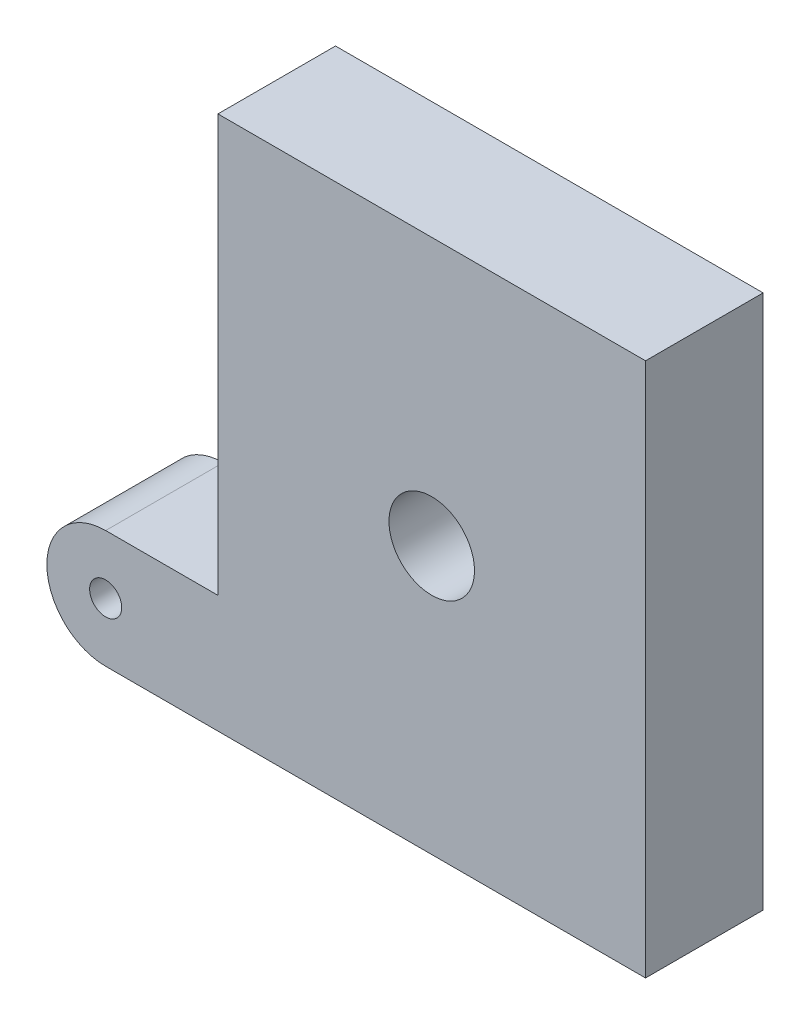
ISO-10303-21;
HEADER;
FILE_DESCRIPTION(('STEP AP214'),'2;1');
FILE_NAME('part.step','',(''),(''),'','','');
FILE_SCHEMA(('AUTOMOTIVE_DESIGN { 1 0 10303 214 1 1 1 1 }'));
ENDSEC;
DATA;
#1=APPLICATION_CONTEXT('core data for automotive mechanical design processes');
#2=APPLICATION_PROTOCOL_DEFINITION('international standard','automotive_design',2000,#1);
#3=PRODUCT_CONTEXT('',#1,'mechanical');
#4=PRODUCT('Part','Part','',(#3));
#5=PRODUCT_RELATED_PRODUCT_CATEGORY('part','',(#4));
#6=PRODUCT_DEFINITION_FORMATION('','',#4);
#7=PRODUCT_DEFINITION_CONTEXT('part definition',#1,'design');
#8=PRODUCT_DEFINITION('design','',#6,#7);
#9=PRODUCT_DEFINITION_SHAPE('','',#8);
#10=(LENGTH_UNIT() NAMED_UNIT(*) SI_UNIT(.MILLI.,.METRE.));
#11=(NAMED_UNIT(*) PLANE_ANGLE_UNIT() SI_UNIT($,.RADIAN.));
#12=(NAMED_UNIT(*) SI_UNIT($,.STERADIAN.) SOLID_ANGLE_UNIT());
#13=UNCERTAINTY_MEASURE_WITH_UNIT(LENGTH_MEASURE(1.E-05),#10,'distance_accuracy_value','');
#14=(GEOMETRIC_REPRESENTATION_CONTEXT(3) GLOBAL_UNCERTAINTY_ASSIGNED_CONTEXT((#13)) GLOBAL_UNIT_ASSIGNED_CONTEXT((#10,
#11,#12)) REPRESENTATION_CONTEXT('',''));
#15=CARTESIAN_POINT('',(0.,0.,0.));
#16=DIRECTION('',(0.,0.,1.));
#17=DIRECTION('',(1.,0.,0.));
#18=AXIS2_PLACEMENT_3D('',#15,#16,#17);
#19=CARTESIAN_POINT('',(50.5,50.,22.));
#20=DIRECTION('',(0.,-1.,0.));
#21=DIRECTION('',(1.,0.,0.));
#22=AXIS2_PLACEMENT_3D('',#19,#20,#21);
#23=PLANE('',#22);
#24=DIRECTION('',(-1.,0.,0.));
#25=VECTOR('',#24,1.);
#26=CARTESIAN_POINT('',(50.5,50.,0.));
#27=LINE('',#26,#25);
#28=CARTESIAN_POINT('',(50.5,50.,0.));
#29=VERTEX_POINT('',#28);
#30=CARTESIAN_POINT('',(-29.5,50.,0.));
#31=VERTEX_POINT('',#30);
#32=EDGE_CURVE('E116',#29,#31,#27,.T.);
#33=ORIENTED_EDGE('',*,*,#32,.T.);
#34=DIRECTION('',(0.,0.,-1.));
#35=VECTOR('',#34,1.);
#36=CARTESIAN_POINT('',(-29.5,50.,22.));
#37=LINE('',#36,#35);
#38=CARTESIAN_POINT('',(-29.5,50.,22.));
#39=VERTEX_POINT('',#38);
#40=EDGE_CURVE('E11',#39,#31,#37,.T.);
#41=ORIENTED_EDGE('',*,*,#40,.F.);
#42=DIRECTION('',(-1.,0.,0.));
#43=VECTOR('',#42,1.);
#44=CARTESIAN_POINT('',(50.5,50.,22.));
#45=LINE('',#44,#43);
#46=CARTESIAN_POINT('',(50.5,50.,22.));
#47=VERTEX_POINT('',#46);
#48=EDGE_CURVE('E128',#47,#39,#45,.T.);
#49=ORIENTED_EDGE('',*,*,#48,.F.);
#50=DIRECTION('',(0.,0.,-1.));
#51=VECTOR('',#50,1.);
#52=CARTESIAN_POINT('',(50.5,50.,22.));
#53=LINE('',#52,#51);
#54=EDGE_CURVE('E115',#47,#29,#53,.T.);
#55=ORIENTED_EDGE('',*,*,#54,.T.);
#56=EDGE_LOOP('',(#33,#41,#49,#55));
#57=FACE_BOUND('',#56,.T.);
#58=ADVANCED_FACE('F32',(#57),#23,.F.);
#59=CARTESIAN_POINT('',(-29.5,50.,22.));
#60=DIRECTION('',(1.,0.,0.));
#61=DIRECTION('',(0.,0.,-1.));
#62=AXIS2_PLACEMENT_3D('',#59,#60,#61);
#63=PLANE('',#62);
#64=DIRECTION('',(0.,-1.,0.));
#65=VECTOR('',#64,1.);
#66=CARTESIAN_POINT('',(-29.5,50.,0.));
#67=LINE('',#66,#65);
#68=CARTESIAN_POINT('',(-29.5,-28.,0.));
#69=VERTEX_POINT('',#68);
#70=EDGE_CURVE('E119',#31,#69,#67,.T.);
#71=ORIENTED_EDGE('',*,*,#70,.T.);
#72=DIRECTION('',(0.,0.,-1.));
#73=VECTOR('',#72,1.);
#74=CARTESIAN_POINT('',(-29.5,-28.,22.));
#75=LINE('',#74,#73);
#76=CARTESIAN_POINT('',(-29.5,-28.,22.));
#77=VERTEX_POINT('',#76);
#78=EDGE_CURVE('E40',#77,#69,#75,.T.);
#79=ORIENTED_EDGE('',*,*,#78,.F.);
#80=DIRECTION('',(0.,-1.,0.));
#81=VECTOR('',#80,1.);
#82=CARTESIAN_POINT('',(-29.5,50.,22.));
#83=LINE('',#82,#81);
#84=EDGE_CURVE('E84',#39,#77,#83,.T.);
#85=ORIENTED_EDGE('',*,*,#84,.F.);
#86=ORIENTED_EDGE('',*,*,#40,.T.);
#87=EDGE_LOOP('',(#71,#79,#85,#86));
#88=FACE_BOUND('',#87,.T.);
#89=ADVANCED_FACE('F153',(#88),#63,.F.);
#90=CARTESIAN_POINT('',(-29.5,-28.,22.));
#91=DIRECTION('',(0.,-1.,0.));
#92=DIRECTION('',(0.,0.,-1.));
#93=AXIS2_PLACEMENT_3D('',#90,#91,#92);
#94=PLANE('',#93);
#95=DIRECTION('',(-1.,0.,0.));
#96=VECTOR('',#95,1.);
#97=CARTESIAN_POINT('',(-29.5,-28.,0.));
#98=LINE('',#97,#96);
#99=CARTESIAN_POINT('',(-50.5,-28.,0.));
#100=VERTEX_POINT('',#99);
#101=EDGE_CURVE('E122',#69,#100,#98,.T.);
#102=ORIENTED_EDGE('',*,*,#101,.T.);
#103=DIRECTION('',(0.,0.,-1.));
#104=VECTOR('',#103,1.);
#105=CARTESIAN_POINT('',(-50.5,-28.,22.));
#106=LINE('',#105,#104);
#107=CARTESIAN_POINT('',(-50.5,-28.,22.));
#108=VERTEX_POINT('',#107);
#109=EDGE_CURVE('E100',#108,#100,#106,.T.);
#110=ORIENTED_EDGE('',*,*,#109,.F.);
#111=DIRECTION('',(-1.,0.,0.));
#112=VECTOR('',#111,1.);
#113=CARTESIAN_POINT('',(-29.5,-28.,22.));
#114=LINE('',#113,#112);
#115=EDGE_CURVE('E108',#77,#108,#114,.T.);
#116=ORIENTED_EDGE('',*,*,#115,.F.);
#117=ORIENTED_EDGE('',*,*,#78,.T.);
#118=EDGE_LOOP('',(#102,#110,#116,#117));
#119=FACE_BOUND('',#118,.T.);
#120=ADVANCED_FACE('F134',(#119),#94,.F.);
#121=CARTESIAN_POINT('',(-50.5,-39.,22.));
#122=DIRECTION('',(0.,0.,-1.));
#123=DIRECTION('',(-1.,0.,0.));
#124=AXIS2_PLACEMENT_3D('',#121,#122,#123);
#125=CYLINDRICAL_SURFACE('',#124,11.);
#126=CARTESIAN_POINT('',(-50.5,-39.,0.));
#127=DIRECTION('',(0.,0.,-1.));
#128=DIRECTION('',(-1.,0.,0.));
#129=AXIS2_PLACEMENT_3D('',#126,#127,#128);
#130=CIRCLE('',#129,11.);
#131=CARTESIAN_POINT('',(-50.5,-50.,0.));
#132=VERTEX_POINT('',#131);
#133=EDGE_CURVE('E99',#132,#100,#130,.T.);
#134=ORIENTED_EDGE('',*,*,#133,.F.);
#135=DIRECTION('',(0.,0.,-1.));
#136=VECTOR('',#135,1.);
#137=CARTESIAN_POINT('',(-50.5,-50.,22.));
#138=LINE('',#137,#136);
#139=CARTESIAN_POINT('',(-50.5,-50.,22.));
#140=VERTEX_POINT('',#139);
#141=EDGE_CURVE('E93',#140,#132,#138,.T.);
#142=ORIENTED_EDGE('',*,*,#141,.F.);
#143=CARTESIAN_POINT('',(-50.5,-39.,22.));
#144=DIRECTION('',(0.,0.,-1.));
#145=DIRECTION('',(-1.,0.,0.));
#146=AXIS2_PLACEMENT_3D('',#143,#144,#145);
#147=CIRCLE('',#146,11.);
#148=EDGE_CURVE('E97',#140,#108,#147,.T.);
#149=ORIENTED_EDGE('',*,*,#148,.T.);
#150=ORIENTED_EDGE('',*,*,#109,.T.);
#151=EDGE_LOOP('',(#134,#142,#149,#150));
#152=FACE_BOUND('',#151,.T.);
#153=ADVANCED_FACE('F95',(#152),#125,.T.);
#154=CARTESIAN_POINT('',(-50.5,-50.,22.));
#155=DIRECTION('',(0.,1.,0.));
#156=DIRECTION('',(0.,0.,1.));
#157=AXIS2_PLACEMENT_3D('',#154,#155,#156);
#158=PLANE('',#157);
#159=DIRECTION('',(1.,0.,0.));
#160=VECTOR('',#159,1.);
#161=CARTESIAN_POINT('',(-50.5,-50.,0.));
#162=LINE('',#161,#160);
#163=CARTESIAN_POINT('',(50.5,-50.,0.));
#164=VERTEX_POINT('',#163);
#165=EDGE_CURVE('E70',#132,#164,#162,.T.);
#166=ORIENTED_EDGE('',*,*,#165,.T.);
#167=DIRECTION('',(0.,0.,-1.));
#168=VECTOR('',#167,1.);
#169=CARTESIAN_POINT('',(50.5,-50.,22.));
#170=LINE('',#169,#168);
#171=CARTESIAN_POINT('',(50.5,-50.,22.));
#172=VERTEX_POINT('',#171);
#173=EDGE_CURVE('E101',#172,#164,#170,.T.);
#174=ORIENTED_EDGE('',*,*,#173,.F.);
#175=DIRECTION('',(1.,0.,0.));
#176=VECTOR('',#175,1.);
#177=CARTESIAN_POINT('',(-50.5,-50.,22.));
#178=LINE('',#177,#176);
#179=EDGE_CURVE('E103',#140,#172,#178,.T.);
#180=ORIENTED_EDGE('',*,*,#179,.F.);
#181=ORIENTED_EDGE('',*,*,#141,.T.);
#182=EDGE_LOOP('',(#166,#174,#180,#181));
#183=FACE_BOUND('',#182,.T.);
#184=ADVANCED_FACE('F104',(#183),#158,.F.);
#185=CARTESIAN_POINT('',(50.5,-50.,22.));
#186=DIRECTION('',(-1.,0.,0.));
#187=DIRECTION('',(0.,0.,1.));
#188=AXIS2_PLACEMENT_3D('',#185,#186,#187);
#189=PLANE('',#188);
#190=DIRECTION('',(0.,1.,0.));
#191=VECTOR('',#190,1.);
#192=CARTESIAN_POINT('',(50.5,-50.,0.));
#193=LINE('',#192,#191);
#194=EDGE_CURVE('E76',#164,#29,#193,.T.);
#195=ORIENTED_EDGE('',*,*,#194,.T.);
#196=ORIENTED_EDGE('',*,*,#54,.F.);
#197=DIRECTION('',(0.,1.,0.));
#198=VECTOR('',#197,1.);
#199=CARTESIAN_POINT('',(50.5,-50.,22.));
#200=LINE('',#199,#198);
#201=EDGE_CURVE('E48',#172,#47,#200,.T.);
#202=ORIENTED_EDGE('',*,*,#201,.F.);
#203=ORIENTED_EDGE('',*,*,#173,.T.);
#204=EDGE_LOOP('',(#195,#196,#202,#203));
#205=FACE_BOUND('',#204,.T.);
#206=ADVANCED_FACE('F141',(#205),#189,.F.);
#207=CARTESIAN_POINT('',(-50.5,-39.,22.));
#208=DIRECTION('',(0.,0.,-1.));
#209=DIRECTION('',(-1.,0.,0.));
#210=AXIS2_PLACEMENT_3D('',#207,#208,#209);
#211=PLANE('',#210);
#212=CARTESIAN_POINT('',(-50.5,-39.,22.));
#213=DIRECTION('',(0.,0.,1.));
#214=DIRECTION('',(1.,0.,0.));
#215=AXIS2_PLACEMENT_3D('',#212,#213,#214);
#216=CIRCLE('',#215,3.);
#217=CARTESIAN_POINT('',(-47.5,-39.,22.));
#218=VERTEX_POINT('',#217);
#219=EDGE_CURVE('E216',#218,#218,#216,.T.);
#220=ORIENTED_EDGE('',*,*,#219,.F.);
#221=EDGE_LOOP('',(#220));
#222=FACE_BOUND('',#221,.T.);
#223=CARTESIAN_POINT('',(10.5,0.,22.));
#224=DIRECTION('',(0.,0.,1.));
#225=DIRECTION('',(1.,0.,0.));
#226=AXIS2_PLACEMENT_3D('',#223,#224,#225);
#227=CIRCLE('',#226,8.);
#228=CARTESIAN_POINT('',(18.5,0.,22.));
#229=VERTEX_POINT('',#228);
#230=EDGE_CURVE('E120',#229,#229,#227,.T.);
#231=ORIENTED_EDGE('',*,*,#230,.F.);
#232=EDGE_LOOP('',(#231));
#233=FACE_BOUND('',#232,.T.);
#234=ORIENTED_EDGE('',*,*,#48,.T.);
#235=ORIENTED_EDGE('',*,*,#84,.T.);
#236=ORIENTED_EDGE('',*,*,#115,.T.);
#237=ORIENTED_EDGE('',*,*,#148,.F.);
#238=ORIENTED_EDGE('',*,*,#179,.T.);
#239=ORIENTED_EDGE('',*,*,#201,.T.);
#240=EDGE_LOOP('',(#234,#235,#236,#237,#238,#239));
#241=FACE_BOUND('',#240,.T.);
#242=ADVANCED_FACE('F106',(#222,#233,#241),#211,.F.);
#243=CARTESIAN_POINT('',(-50.5,-39.,0.));
#244=DIRECTION('',(0.,0.,-1.));
#245=DIRECTION('',(-1.,0.,0.));
#246=AXIS2_PLACEMENT_3D('',#243,#244,#245);
#247=PLANE('',#246);
#248=CARTESIAN_POINT('',(-50.5,-39.,0.));
#249=DIRECTION('',(0.,0.,1.));
#250=DIRECTION('',(1.,0.,0.));
#251=AXIS2_PLACEMENT_3D('',#248,#249,#250);
#252=CIRCLE('',#251,3.);
#253=CARTESIAN_POINT('',(-47.5,-39.,0.));
#254=VERTEX_POINT('',#253);
#255=EDGE_CURVE('E219',#254,#254,#252,.T.);
#256=ORIENTED_EDGE('',*,*,#255,.T.);
#257=EDGE_LOOP('',(#256));
#258=FACE_BOUND('',#257,.T.);
#259=CARTESIAN_POINT('',(10.5,0.,0.));
#260=DIRECTION('',(0.,0.,1.));
#261=DIRECTION('',(1.,0.,0.));
#262=AXIS2_PLACEMENT_3D('',#259,#260,#261);
#263=CIRCLE('',#262,8.);
#264=CARTESIAN_POINT('',(18.5,0.,0.));
#265=VERTEX_POINT('',#264);
#266=EDGE_CURVE('E221',#265,#265,#263,.T.);
#267=ORIENTED_EDGE('',*,*,#266,.T.);
#268=EDGE_LOOP('',(#267));
#269=FACE_BOUND('',#268,.T.);
#270=ORIENTED_EDGE('',*,*,#32,.F.);
#271=ORIENTED_EDGE('',*,*,#194,.F.);
#272=ORIENTED_EDGE('',*,*,#165,.F.);
#273=ORIENTED_EDGE('',*,*,#133,.T.);
#274=ORIENTED_EDGE('',*,*,#101,.F.);
#275=ORIENTED_EDGE('',*,*,#70,.F.);
#276=EDGE_LOOP('',(#270,#271,#272,#273,#274,#275));
#277=FACE_BOUND('',#276,.T.);
#278=ADVANCED_FACE('F137',(#258,#269,#277),#247,.T.);
#279=CARTESIAN_POINT('',(10.5,0.,22.));
#280=DIRECTION('',(0.,0.,-1.));
#281=DIRECTION('',(-1.,0.,0.));
#282=AXIS2_PLACEMENT_3D('',#279,#280,#281);
#283=CYLINDRICAL_SURFACE('',#282,8.);
#284=ORIENTED_EDGE('',*,*,#230,.T.);
#285=EDGE_LOOP('',(#284));
#286=FACE_BOUND('',#285,.T.);
#287=ORIENTED_EDGE('',*,*,#266,.F.);
#288=EDGE_LOOP('',(#287));
#289=FACE_BOUND('',#288,.T.);
#290=ADVANCED_FACE('F181',(#286,#289),#283,.F.);
#291=CARTESIAN_POINT('',(-50.5,-39.,22.));
#292=DIRECTION('',(0.,0.,-1.));
#293=DIRECTION('',(-1.,0.,0.));
#294=AXIS2_PLACEMENT_3D('',#291,#292,#293);
#295=CYLINDRICAL_SURFACE('',#294,3.);
#296=ORIENTED_EDGE('',*,*,#219,.T.);
#297=EDGE_LOOP('',(#296));
#298=FACE_BOUND('',#297,.T.);
#299=ORIENTED_EDGE('',*,*,#255,.F.);
#300=EDGE_LOOP('',(#299));
#301=FACE_BOUND('',#300,.T.);
#302=ADVANCED_FACE('F186',(#298,#301),#295,.F.);
#303=CLOSED_SHELL('',(#58,#89,#120,#153,#184,#206,#242,#278,#290,#302));
#304=MANIFOLD_SOLID_BREP('B2',#303);
#305=ADVANCED_BREP_SHAPE_REPRESENTATION('',(#18,#304),#14);
#306=SHAPE_DEFINITION_REPRESENTATION(#9,#305);
ENDSEC;
END-ISO-10303-21;
